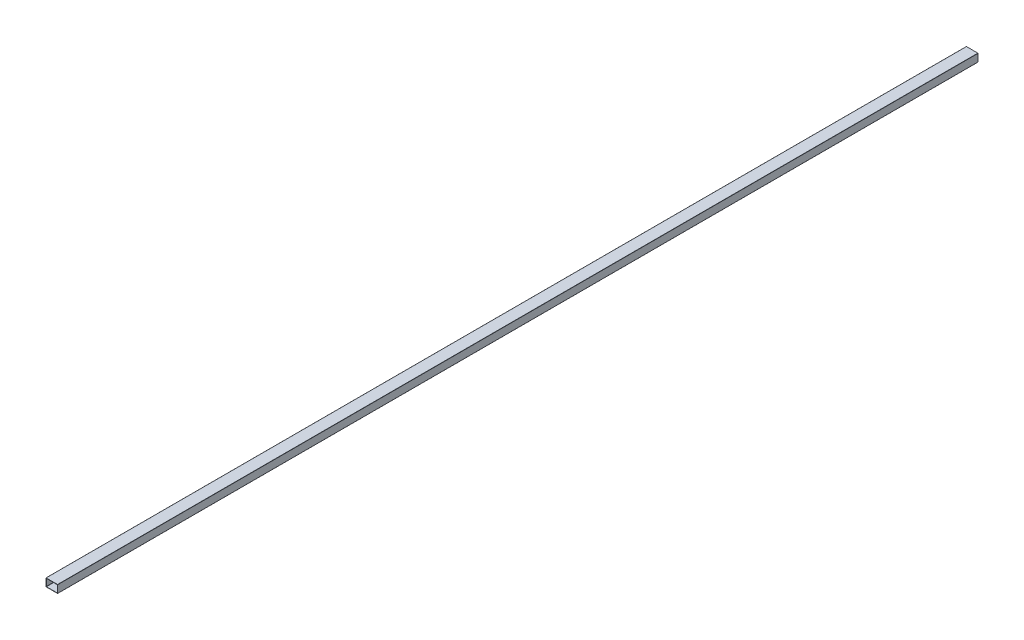
ISO-10303-21;
HEADER;
FILE_DESCRIPTION(('STEP AP214'),'2;1');
FILE_NAME('part.step','',(''),(''),'','','');
FILE_SCHEMA(('AUTOMOTIVE_DESIGN { 1 0 10303 214 1 1 1 1 }'));
ENDSEC;
DATA;
#1=APPLICATION_CONTEXT('core data for automotive mechanical design processes');
#2=APPLICATION_PROTOCOL_DEFINITION('international standard','automotive_design',2000,#1);
#3=PRODUCT_CONTEXT('',#1,'mechanical');
#4=PRODUCT('Part','Part','',(#3));
#5=PRODUCT_RELATED_PRODUCT_CATEGORY('part','',(#4));
#6=PRODUCT_DEFINITION_FORMATION('','',#4);
#7=PRODUCT_DEFINITION_CONTEXT('part definition',#1,'design');
#8=PRODUCT_DEFINITION('design','',#6,#7);
#9=PRODUCT_DEFINITION_SHAPE('','',#8);
#10=(LENGTH_UNIT() NAMED_UNIT(*) SI_UNIT(.MILLI.,.METRE.));
#11=(NAMED_UNIT(*) PLANE_ANGLE_UNIT() SI_UNIT($,.RADIAN.));
#12=(NAMED_UNIT(*) SI_UNIT($,.STERADIAN.) SOLID_ANGLE_UNIT());
#13=UNCERTAINTY_MEASURE_WITH_UNIT(LENGTH_MEASURE(1.E-05),#10,'distance_accuracy_value','');
#14=(GEOMETRIC_REPRESENTATION_CONTEXT(3) GLOBAL_UNCERTAINTY_ASSIGNED_CONTEXT((#13)) GLOBAL_UNIT_ASSIGNED_CONTEXT((#10,
#11,#12)) REPRESENTATION_CONTEXT('',''));
#15=CARTESIAN_POINT('',(0.,0.,0.));
#16=DIRECTION('',(0.,0.,1.));
#17=DIRECTION('',(1.,0.,0.));
#18=AXIS2_PLACEMENT_3D('',#15,#16,#17);
#19=CARTESIAN_POINT('',(38.1,-25.4,-6000.));
#20=DIRECTION('',(1.,0.,0.));
#21=DIRECTION('',(0.,0.,-1.));
#22=AXIS2_PLACEMENT_3D('',#19,#20,#21);
#23=PLANE('',#22);
#24=DIRECTION('',(0.,1.,0.));
#25=VECTOR('',#24,1.);
#26=CARTESIAN_POINT('',(38.1,-25.4,0.));
#27=LINE('',#26,#25);
#28=CARTESIAN_POINT('',(38.1,-24.4,0.));
#29=VERTEX_POINT('',#28);
#30=CARTESIAN_POINT('',(38.1,24.4,0.));
#31=VERTEX_POINT('',#30);
#32=EDGE_CURVE('E197',#29,#31,#27,.T.);
#33=ORIENTED_EDGE('',*,*,#32,.F.);
#34=DIRECTION('',(0.,0.,1.));
#35=VECTOR('',#34,1.);
#36=CARTESIAN_POINT('',(38.1,-24.4,-6000.));
#37=LINE('',#36,#35);
#38=CARTESIAN_POINT('',(38.1,-24.4,-6000.));
#39=VERTEX_POINT('',#38);
#40=EDGE_CURVE('E158',#29,#39,#37,.F.);
#41=ORIENTED_EDGE('',*,*,#40,.T.);
#42=DIRECTION('',(0.,1.,0.));
#43=VECTOR('',#42,1.);
#44=CARTESIAN_POINT('',(38.1,-25.4,-6000.));
#45=LINE('',#44,#43);
#46=CARTESIAN_POINT('',(38.1,24.4,-6000.));
#47=VERTEX_POINT('',#46);
#48=EDGE_CURVE('E185',#39,#47,#45,.T.);
#49=ORIENTED_EDGE('',*,*,#48,.T.);
#50=DIRECTION('',(0.,0.,1.));
#51=VECTOR('',#50,1.);
#52=CARTESIAN_POINT('',(38.1,24.4,-6000.));
#53=LINE('',#52,#51);
#54=EDGE_CURVE('E251',#47,#31,#53,.T.);
#55=ORIENTED_EDGE('',*,*,#54,.T.);
#56=EDGE_LOOP('',(#33,#41,#49,#55));
#57=FACE_BOUND('',#56,.T.);
#58=ADVANCED_FACE('F33',(#57),#23,.T.);
#59=CARTESIAN_POINT('',(-38.1,-25.4,-6000.));
#60=DIRECTION('',(0.,-1.,0.));
#61=DIRECTION('',(0.,0.,-1.));
#62=AXIS2_PLACEMENT_3D('',#59,#60,#61);
#63=PLANE('',#62);
#64=DIRECTION('',(1.,0.,0.));
#65=VECTOR('',#64,1.);
#66=CARTESIAN_POINT('',(-38.1,-25.4,0.));
#67=LINE('',#66,#65);
#68=CARTESIAN_POINT('',(-37.1,-25.4,0.));
#69=VERTEX_POINT('',#68);
#70=CARTESIAN_POINT('',(37.1,-25.4,0.));
#71=VERTEX_POINT('',#70);
#72=EDGE_CURVE('E189',#69,#71,#67,.T.);
#73=ORIENTED_EDGE('',*,*,#72,.F.);
#74=DIRECTION('',(0.,0.,1.));
#75=VECTOR('',#74,1.);
#76=CARTESIAN_POINT('',(-37.1,-25.4,-6000.));
#77=LINE('',#76,#75);
#78=CARTESIAN_POINT('',(-37.1,-25.4,-6000.));
#79=VERTEX_POINT('',#78);
#80=EDGE_CURVE('E238',#69,#79,#77,.F.);
#81=ORIENTED_EDGE('',*,*,#80,.T.);
#82=DIRECTION('',(1.,0.,0.));
#83=VECTOR('',#82,1.);
#84=CARTESIAN_POINT('',(-38.1,-25.4,-6000.));
#85=LINE('',#84,#83);
#86=CARTESIAN_POINT('',(37.1,-25.4,-6000.));
#87=VERTEX_POINT('',#86);
#88=EDGE_CURVE('E194',#79,#87,#85,.T.);
#89=ORIENTED_EDGE('',*,*,#88,.T.);
#90=DIRECTION('',(0.,0.,1.));
#91=VECTOR('',#90,1.);
#92=CARTESIAN_POINT('',(37.1,-25.4,-6000.));
#93=LINE('',#92,#91);
#94=EDGE_CURVE('E235',#87,#71,#93,.T.);
#95=ORIENTED_EDGE('',*,*,#94,.T.);
#96=EDGE_LOOP('',(#73,#81,#89,#95));
#97=FACE_BOUND('',#96,.T.);
#98=ADVANCED_FACE('F305',(#97),#63,.T.);
#99=CARTESIAN_POINT('',(-38.1,-25.4,-6000.));
#100=DIRECTION('',(-1.,0.,0.));
#101=DIRECTION('',(0.,0.,1.));
#102=AXIS2_PLACEMENT_3D('',#99,#100,#101);
#103=PLANE('',#102);
#104=DIRECTION('',(0.,-1.,0.));
#105=VECTOR('',#104,1.);
#106=CARTESIAN_POINT('',(-38.1,-25.4,-6000.));
#107=LINE('',#106,#105);
#108=CARTESIAN_POINT('',(-38.1,24.4,-6000.));
#109=VERTEX_POINT('',#108);
#110=CARTESIAN_POINT('',(-38.1,-24.4,-6000.));
#111=VERTEX_POINT('',#110);
#112=EDGE_CURVE('E191',#109,#111,#107,.T.);
#113=ORIENTED_EDGE('',*,*,#112,.T.);
#114=DIRECTION('',(0.,0.,1.));
#115=VECTOR('',#114,1.);
#116=CARTESIAN_POINT('',(-38.1,-24.4,-6000.));
#117=LINE('',#116,#115);
#118=CARTESIAN_POINT('',(-38.1,-24.4,0.));
#119=VERTEX_POINT('',#118);
#120=EDGE_CURVE('E224',#111,#119,#117,.T.);
#121=ORIENTED_EDGE('',*,*,#120,.T.);
#122=DIRECTION('',(0.,-1.,0.));
#123=VECTOR('',#122,1.);
#124=CARTESIAN_POINT('',(-38.1,-25.4,0.));
#125=LINE('',#124,#123);
#126=CARTESIAN_POINT('',(-38.1,24.4,0.));
#127=VERTEX_POINT('',#126);
#128=EDGE_CURVE('E203',#127,#119,#125,.T.);
#129=ORIENTED_EDGE('',*,*,#128,.F.);
#130=DIRECTION('',(0.,0.,1.));
#131=VECTOR('',#130,1.);
#132=CARTESIAN_POINT('',(-38.1,24.4,-6000.));
#133=LINE('',#132,#131);
#134=EDGE_CURVE('E222',#127,#109,#133,.F.);
#135=ORIENTED_EDGE('',*,*,#134,.T.);
#136=EDGE_LOOP('',(#113,#121,#129,#135));
#137=FACE_BOUND('',#136,.T.);
#138=ADVANCED_FACE('F311',(#137),#103,.T.);
#139=CARTESIAN_POINT('',(-38.1,25.4,-6000.));
#140=DIRECTION('',(0.,1.,0.));
#141=DIRECTION('',(0.,0.,1.));
#142=AXIS2_PLACEMENT_3D('',#139,#140,#141);
#143=PLANE('',#142);
#144=DIRECTION('',(-1.,0.,0.));
#145=VECTOR('',#144,1.);
#146=CARTESIAN_POINT('',(-38.1,25.4,-6000.));
#147=LINE('',#146,#145);
#148=CARTESIAN_POINT('',(37.1,25.4,-6000.));
#149=VERTEX_POINT('',#148);
#150=CARTESIAN_POINT('',(-37.1,25.4,-6000.));
#151=VERTEX_POINT('',#150);
#152=EDGE_CURVE('E188',#149,#151,#147,.T.);
#153=ORIENTED_EDGE('',*,*,#152,.T.);
#154=DIRECTION('',(0.,0.,1.));
#155=VECTOR('',#154,1.);
#156=CARTESIAN_POINT('',(-37.1,25.4,-6000.));
#157=LINE('',#156,#155);
#158=CARTESIAN_POINT('',(-37.1,25.4,0.));
#159=VERTEX_POINT('',#158);
#160=EDGE_CURVE('E248',#151,#159,#157,.T.);
#161=ORIENTED_EDGE('',*,*,#160,.T.);
#162=DIRECTION('',(-1.,0.,0.));
#163=VECTOR('',#162,1.);
#164=CARTESIAN_POINT('',(-38.1,25.4,0.));
#165=LINE('',#164,#163);
#166=CARTESIAN_POINT('',(37.1,25.4,0.));
#167=VERTEX_POINT('',#166);
#168=EDGE_CURVE('E200',#167,#159,#165,.T.);
#169=ORIENTED_EDGE('',*,*,#168,.F.);
#170=DIRECTION('',(0.,0.,1.));
#171=VECTOR('',#170,1.);
#172=CARTESIAN_POINT('',(37.1,25.4,-6000.));
#173=LINE('',#172,#171);
#174=EDGE_CURVE('E55',#167,#149,#173,.F.);
#175=ORIENTED_EDGE('',*,*,#174,.T.);
#176=EDGE_LOOP('',(#153,#161,#169,#175));
#177=FACE_BOUND('',#176,.T.);
#178=ADVANCED_FACE('F316',(#177),#143,.T.);
#179=CARTESIAN_POINT('',(0.,0.,-6000.));
#180=DIRECTION('',(0.,0.,-1.));
#181=DIRECTION('',(-1.,0.,0.));
#182=AXIS2_PLACEMENT_3D('',#179,#180,#181);
#183=PLANE('',#182);
#184=DIRECTION('',(0.,-1.,0.));
#185=VECTOR('',#184,1.);
#186=CARTESIAN_POINT('',(-36.21,-23.51,-6000.));
#187=LINE('',#186,#185);
#188=CARTESIAN_POINT('',(-36.21,22.51,-6000.));
#189=VERTEX_POINT('',#188);
#190=CARTESIAN_POINT('',(-36.21,-22.51,-6000.));
#191=VERTEX_POINT('',#190);
#192=EDGE_CURVE('E167',#189,#191,#187,.T.);
#193=ORIENTED_EDGE('',*,*,#192,.T.);
#194=CARTESIAN_POINT('',(-35.21,-22.51,-6000.));
#195=DIRECTION('',(0.,0.,-1.));
#196=DIRECTION('',(-1.,0.,0.));
#197=AXIS2_PLACEMENT_3D('',#194,#195,#196);
#198=CIRCLE('',#197,1.);
#199=CARTESIAN_POINT('',(-35.21,-23.51,-6000.));
#200=VERTEX_POINT('',#199);
#201=EDGE_CURVE('E11',#191,#200,#198,.F.);
#202=ORIENTED_EDGE('',*,*,#201,.T.);
#203=DIRECTION('',(1.,0.,0.));
#204=VECTOR('',#203,1.);
#205=CARTESIAN_POINT('',(-36.21,-23.51,-6000.));
#206=LINE('',#205,#204);
#207=CARTESIAN_POINT('',(35.21,-23.51,-6000.));
#208=VERTEX_POINT('',#207);
#209=EDGE_CURVE('E175',#200,#208,#206,.T.);
#210=ORIENTED_EDGE('',*,*,#209,.T.);
#211=CARTESIAN_POINT('',(35.21,-22.51,-6000.));
#212=DIRECTION('',(0.,0.,-1.));
#213=DIRECTION('',(-1.,0.,0.));
#214=AXIS2_PLACEMENT_3D('',#211,#212,#213);
#215=CIRCLE('',#214,1.);
#216=CARTESIAN_POINT('',(36.21,-22.51,-6000.));
#217=VERTEX_POINT('',#216);
#218=EDGE_CURVE('E262',#208,#217,#215,.F.);
#219=ORIENTED_EDGE('',*,*,#218,.T.);
#220=DIRECTION('',(0.,1.,0.));
#221=VECTOR('',#220,1.);
#222=CARTESIAN_POINT('',(36.21,-23.51,-6000.));
#223=LINE('',#222,#221);
#224=CARTESIAN_POINT('',(36.21,22.51,-6000.));
#225=VERTEX_POINT('',#224);
#226=EDGE_CURVE('E179',#217,#225,#223,.T.);
#227=ORIENTED_EDGE('',*,*,#226,.T.);
#228=CARTESIAN_POINT('',(35.21,22.51,-6000.));
#229=DIRECTION('',(0.,0.,-1.));
#230=DIRECTION('',(-1.,0.,0.));
#231=AXIS2_PLACEMENT_3D('',#228,#229,#230);
#232=CIRCLE('',#231,1.);
#233=CARTESIAN_POINT('',(35.21,23.51,-6000.));
#234=VERTEX_POINT('',#233);
#235=EDGE_CURVE('E258',#225,#234,#232,.F.);
#236=ORIENTED_EDGE('',*,*,#235,.T.);
#237=DIRECTION('',(-1.,0.,0.));
#238=VECTOR('',#237,1.);
#239=CARTESIAN_POINT('',(-36.21,23.51,-6000.));
#240=LINE('',#239,#238);
#241=CARTESIAN_POINT('',(-35.21,23.51,-6000.));
#242=VERTEX_POINT('',#241);
#243=EDGE_CURVE('E277',#234,#242,#240,.T.);
#244=ORIENTED_EDGE('',*,*,#243,.T.);
#245=CARTESIAN_POINT('',(-35.21,22.51,-6000.));
#246=DIRECTION('',(0.,0.,-1.));
#247=DIRECTION('',(-1.,0.,0.));
#248=AXIS2_PLACEMENT_3D('',#245,#246,#247);
#249=CIRCLE('',#248,1.);
#250=EDGE_CURVE('E157',#242,#189,#249,.F.);
#251=ORIENTED_EDGE('',*,*,#250,.T.);
#252=EDGE_LOOP('',(#193,#202,#210,#219,#227,#236,#244,#251));
#253=FACE_BOUND('',#252,.T.);
#254=ORIENTED_EDGE('',*,*,#88,.F.);
#255=CARTESIAN_POINT('',(-37.1,-24.4,-6000.));
#256=DIRECTION('',(0.,0.,-1.));
#257=DIRECTION('',(-1.,0.,0.));
#258=AXIS2_PLACEMENT_3D('',#255,#256,#257);
#259=CIRCLE('',#258,1.);
#260=EDGE_CURVE('E245',#79,#111,#259,.T.);
#261=ORIENTED_EDGE('',*,*,#260,.T.);
#262=ORIENTED_EDGE('',*,*,#112,.F.);
#263=CARTESIAN_POINT('',(-37.1,24.4,-6000.));
#264=DIRECTION('',(0.,0.,-1.));
#265=DIRECTION('',(-1.,0.,0.));
#266=AXIS2_PLACEMENT_3D('',#263,#264,#265);
#267=CIRCLE('',#266,1.);
#268=EDGE_CURVE('E48',#109,#151,#267,.T.);
#269=ORIENTED_EDGE('',*,*,#268,.T.);
#270=ORIENTED_EDGE('',*,*,#152,.F.);
#271=CARTESIAN_POINT('',(37.1,24.4,-6000.));
#272=DIRECTION('',(0.,0.,-1.));
#273=DIRECTION('',(-1.,0.,0.));
#274=AXIS2_PLACEMENT_3D('',#271,#272,#273);
#275=CIRCLE('',#274,1.);
#276=EDGE_CURVE('E240',#149,#47,#275,.T.);
#277=ORIENTED_EDGE('',*,*,#276,.T.);
#278=ORIENTED_EDGE('',*,*,#48,.F.);
#279=CARTESIAN_POINT('',(37.1,-24.4,-6000.));
#280=DIRECTION('',(0.,0.,-1.));
#281=DIRECTION('',(-1.,0.,0.));
#282=AXIS2_PLACEMENT_3D('',#279,#280,#281);
#283=CIRCLE('',#282,1.);
#284=EDGE_CURVE('E242',#39,#87,#283,.T.);
#285=ORIENTED_EDGE('',*,*,#284,.T.);
#286=EDGE_LOOP('',(#254,#261,#262,#269,#270,#277,#278,#285));
#287=FACE_BOUND('',#286,.T.);
#288=ADVANCED_FACE('F267',(#253,#287),#183,.T.);
#289=CARTESIAN_POINT('',(0.,0.,0.));
#290=DIRECTION('',(0.,0.,-1.));
#291=DIRECTION('',(-1.,0.,0.));
#292=AXIS2_PLACEMENT_3D('',#289,#290,#291);
#293=PLANE('',#292);
#294=DIRECTION('',(0.,1.,0.));
#295=VECTOR('',#294,1.);
#296=CARTESIAN_POINT('',(36.21,-23.51,0.));
#297=LINE('',#296,#295);
#298=CARTESIAN_POINT('',(36.21,-22.51,0.));
#299=VERTEX_POINT('',#298);
#300=CARTESIAN_POINT('',(36.21,22.51,0.));
#301=VERTEX_POINT('',#300);
#302=EDGE_CURVE('E181',#299,#301,#297,.T.);
#303=ORIENTED_EDGE('',*,*,#302,.F.);
#304=CARTESIAN_POINT('',(35.21,-22.51,0.));
#305=DIRECTION('',(0.,0.,-1.));
#306=DIRECTION('',(-1.,0.,0.));
#307=AXIS2_PLACEMENT_3D('',#304,#305,#306);
#308=CIRCLE('',#307,1.);
#309=CARTESIAN_POINT('',(35.21,-23.51,0.));
#310=VERTEX_POINT('',#309);
#311=EDGE_CURVE('E260',#299,#310,#308,.T.);
#312=ORIENTED_EDGE('',*,*,#311,.T.);
#313=DIRECTION('',(1.,0.,0.));
#314=VECTOR('',#313,1.);
#315=CARTESIAN_POINT('',(-36.21,-23.51,0.));
#316=LINE('',#315,#314);
#317=CARTESIAN_POINT('',(-35.21,-23.51,0.));
#318=VERTEX_POINT('',#317);
#319=EDGE_CURVE('E281',#318,#310,#316,.T.);
#320=ORIENTED_EDGE('',*,*,#319,.F.);
#321=CARTESIAN_POINT('',(-35.21,-22.51,0.));
#322=DIRECTION('',(0.,0.,-1.));
#323=DIRECTION('',(-1.,0.,0.));
#324=AXIS2_PLACEMENT_3D('',#321,#322,#323);
#325=CIRCLE('',#324,1.);
#326=CARTESIAN_POINT('',(-36.21,-22.51,0.));
#327=VERTEX_POINT('',#326);
#328=EDGE_CURVE('E41',#318,#327,#325,.T.);
#329=ORIENTED_EDGE('',*,*,#328,.T.);
#330=DIRECTION('',(0.,-1.,0.));
#331=VECTOR('',#330,1.);
#332=CARTESIAN_POINT('',(-36.21,-23.51,0.));
#333=LINE('',#332,#331);
#334=CARTESIAN_POINT('',(-36.21,22.51,0.));
#335=VERTEX_POINT('',#334);
#336=EDGE_CURVE('E164',#335,#327,#333,.T.);
#337=ORIENTED_EDGE('',*,*,#336,.F.);
#338=CARTESIAN_POINT('',(-35.21,22.51,0.));
#339=DIRECTION('',(0.,0.,-1.));
#340=DIRECTION('',(-1.,0.,0.));
#341=AXIS2_PLACEMENT_3D('',#338,#339,#340);
#342=CIRCLE('',#341,1.);
#343=CARTESIAN_POINT('',(-35.21,23.51,0.));
#344=VERTEX_POINT('',#343);
#345=EDGE_CURVE('E147',#335,#344,#342,.T.);
#346=ORIENTED_EDGE('',*,*,#345,.T.);
#347=DIRECTION('',(-1.,0.,0.));
#348=VECTOR('',#347,1.);
#349=CARTESIAN_POINT('',(-36.21,23.51,0.));
#350=LINE('',#349,#348);
#351=CARTESIAN_POINT('',(35.21,23.51,0.));
#352=VERTEX_POINT('',#351);
#353=EDGE_CURVE('E176',#352,#344,#350,.T.);
#354=ORIENTED_EDGE('',*,*,#353,.F.);
#355=CARTESIAN_POINT('',(35.21,22.51,0.));
#356=DIRECTION('',(0.,0.,-1.));
#357=DIRECTION('',(-1.,0.,0.));
#358=AXIS2_PLACEMENT_3D('',#355,#356,#357);
#359=CIRCLE('',#358,1.);
#360=EDGE_CURVE('E256',#352,#301,#359,.T.);
#361=ORIENTED_EDGE('',*,*,#360,.T.);
#362=EDGE_LOOP('',(#303,#312,#320,#329,#337,#346,#354,#361));
#363=FACE_BOUND('',#362,.T.);
#364=ORIENTED_EDGE('',*,*,#128,.T.);
#365=CARTESIAN_POINT('',(-37.1,-24.4,0.));
#366=DIRECTION('',(0.,0.,-1.));
#367=DIRECTION('',(-1.,0.,0.));
#368=AXIS2_PLACEMENT_3D('',#365,#366,#367);
#369=CIRCLE('',#368,1.);
#370=EDGE_CURVE('E233',#119,#69,#369,.F.);
#371=ORIENTED_EDGE('',*,*,#370,.T.);
#372=ORIENTED_EDGE('',*,*,#72,.T.);
#373=CARTESIAN_POINT('',(37.1,-24.4,0.));
#374=DIRECTION('',(0.,0.,-1.));
#375=DIRECTION('',(-1.,0.,0.));
#376=AXIS2_PLACEMENT_3D('',#373,#374,#375);
#377=CIRCLE('',#376,1.);
#378=EDGE_CURVE('E229',#71,#29,#377,.F.);
#379=ORIENTED_EDGE('',*,*,#378,.T.);
#380=ORIENTED_EDGE('',*,*,#32,.T.);
#381=CARTESIAN_POINT('',(37.1,24.4,0.));
#382=DIRECTION('',(0.,0.,-1.));
#383=DIRECTION('',(-1.,0.,0.));
#384=AXIS2_PLACEMENT_3D('',#381,#382,#383);
#385=CIRCLE('',#384,1.);
#386=EDGE_CURVE('E227',#31,#167,#385,.F.);
#387=ORIENTED_EDGE('',*,*,#386,.T.);
#388=ORIENTED_EDGE('',*,*,#168,.T.);
#389=CARTESIAN_POINT('',(-37.1,24.4,0.));
#390=DIRECTION('',(0.,0.,-1.));
#391=DIRECTION('',(-1.,0.,0.));
#392=AXIS2_PLACEMENT_3D('',#389,#390,#391);
#393=CIRCLE('',#392,1.);
#394=EDGE_CURVE('E231',#159,#127,#393,.F.);
#395=ORIENTED_EDGE('',*,*,#394,.T.);
#396=EDGE_LOOP('',(#364,#371,#372,#379,#380,#387,#388,#395));
#397=FACE_BOUND('',#396,.T.);
#398=ADVANCED_FACE('F172',(#363,#397),#293,.F.);
#399=CARTESIAN_POINT('',(-36.21,-23.51,-6000.));
#400=DIRECTION('',(0.,-1.,0.));
#401=DIRECTION('',(0.,0.,-1.));
#402=AXIS2_PLACEMENT_3D('',#399,#400,#401);
#403=PLANE('',#402);
#404=ORIENTED_EDGE('',*,*,#319,.T.);
#405=DIRECTION('',(0.,0.,1.));
#406=VECTOR('',#405,1.);
#407=CARTESIAN_POINT('',(35.21,-23.51,-6000.));
#408=LINE('',#407,#406);
#409=EDGE_CURVE('E220',#310,#208,#408,.F.);
#410=ORIENTED_EDGE('',*,*,#409,.T.);
#411=ORIENTED_EDGE('',*,*,#209,.F.);
#412=DIRECTION('',(0.,0.,1.));
#413=VECTOR('',#412,1.);
#414=CARTESIAN_POINT('',(-35.21,-23.51,0.));
#415=LINE('',#414,#413);
#416=EDGE_CURVE('E217',#200,#318,#415,.T.);
#417=ORIENTED_EDGE('',*,*,#416,.T.);
#418=EDGE_LOOP('',(#404,#410,#411,#417));
#419=FACE_BOUND('',#418,.T.);
#420=ADVANCED_FACE('F283',(#419),#403,.F.);
#421=CARTESIAN_POINT('',(-36.21,-23.51,-6000.));
#422=DIRECTION('',(-1.,0.,0.));
#423=DIRECTION('',(0.,0.,1.));
#424=AXIS2_PLACEMENT_3D('',#421,#422,#423);
#425=PLANE('',#424);
#426=ORIENTED_EDGE('',*,*,#192,.F.);
#427=DIRECTION('',(0.,0.,1.));
#428=VECTOR('',#427,1.);
#429=CARTESIAN_POINT('',(-36.21,22.51,0.));
#430=LINE('',#429,#428);
#431=EDGE_CURVE('E151',#189,#335,#430,.T.);
#432=ORIENTED_EDGE('',*,*,#431,.T.);
#433=ORIENTED_EDGE('',*,*,#336,.T.);
#434=DIRECTION('',(0.,0.,1.));
#435=VECTOR('',#434,1.);
#436=CARTESIAN_POINT('',(-36.21,-22.51,-6000.));
#437=LINE('',#436,#435);
#438=EDGE_CURVE('E169',#327,#191,#437,.F.);
#439=ORIENTED_EDGE('',*,*,#438,.T.);
#440=EDGE_LOOP('',(#426,#432,#433,#439));
#441=FACE_BOUND('',#440,.T.);
#442=ADVANCED_FACE('F163',(#441),#425,.F.);
#443=CARTESIAN_POINT('',(-36.21,23.51,-6000.));
#444=DIRECTION('',(0.,1.,0.));
#445=DIRECTION('',(0.,0.,1.));
#446=AXIS2_PLACEMENT_3D('',#443,#444,#445);
#447=PLANE('',#446);
#448=ORIENTED_EDGE('',*,*,#353,.T.);
#449=DIRECTION('',(0.,0.,1.));
#450=VECTOR('',#449,1.);
#451=CARTESIAN_POINT('',(-35.21,23.51,-6000.));
#452=LINE('',#451,#450);
#453=EDGE_CURVE('E152',#344,#242,#452,.F.);
#454=ORIENTED_EDGE('',*,*,#453,.T.);
#455=ORIENTED_EDGE('',*,*,#243,.F.);
#456=DIRECTION('',(0.,0.,1.));
#457=VECTOR('',#456,1.);
#458=CARTESIAN_POINT('',(35.21,23.51,0.));
#459=LINE('',#458,#457);
#460=EDGE_CURVE('E168',#234,#352,#459,.T.);
#461=ORIENTED_EDGE('',*,*,#460,.T.);
#462=EDGE_LOOP('',(#448,#454,#455,#461));
#463=FACE_BOUND('',#462,.T.);
#464=ADVANCED_FACE('F292',(#463),#447,.F.);
#465=CARTESIAN_POINT('',(36.21,-23.51,-6000.));
#466=DIRECTION('',(1.,0.,0.));
#467=DIRECTION('',(0.,0.,-1.));
#468=AXIS2_PLACEMENT_3D('',#465,#466,#467);
#469=PLANE('',#468);
#470=ORIENTED_EDGE('',*,*,#302,.T.);
#471=DIRECTION('',(0.,0.,1.));
#472=VECTOR('',#471,1.);
#473=CARTESIAN_POINT('',(36.21,22.51,-6000.));
#474=LINE('',#473,#472);
#475=EDGE_CURVE('E215',#301,#225,#474,.F.);
#476=ORIENTED_EDGE('',*,*,#475,.T.);
#477=ORIENTED_EDGE('',*,*,#226,.F.);
#478=DIRECTION('',(0.,0.,1.));
#479=VECTOR('',#478,1.);
#480=CARTESIAN_POINT('',(36.21,-22.51,0.));
#481=LINE('',#480,#479);
#482=EDGE_CURVE('E212',#217,#299,#481,.T.);
#483=ORIENTED_EDGE('',*,*,#482,.T.);
#484=EDGE_LOOP('',(#470,#476,#477,#483));
#485=FACE_BOUND('',#484,.T.);
#486=ADVANCED_FACE('F275',(#485),#469,.F.);
#487=CARTESIAN_POINT('',(-35.21,22.51,-6000.));
#488=DIRECTION('',(0.,0.,-1.));
#489=DIRECTION('',(-1.,0.,0.));
#490=AXIS2_PLACEMENT_3D('',#487,#488,#489);
#491=CYLINDRICAL_SURFACE('',#490,1.);
#492=ORIENTED_EDGE('',*,*,#250,.F.);
#493=ORIENTED_EDGE('',*,*,#453,.F.);
#494=ORIENTED_EDGE('',*,*,#345,.F.);
#495=ORIENTED_EDGE('',*,*,#431,.F.);
#496=EDGE_LOOP('',(#492,#493,#494,#495));
#497=FACE_BOUND('',#496,.T.);
#498=ADVANCED_FACE('F150',(#497),#491,.F.);
#499=CARTESIAN_POINT('',(35.21,22.51,-6000.));
#500=DIRECTION('',(0.,0.,-1.));
#501=DIRECTION('',(-1.,0.,0.));
#502=AXIS2_PLACEMENT_3D('',#499,#500,#501);
#503=CYLINDRICAL_SURFACE('',#502,1.);
#504=ORIENTED_EDGE('',*,*,#235,.F.);
#505=ORIENTED_EDGE('',*,*,#475,.F.);
#506=ORIENTED_EDGE('',*,*,#360,.F.);
#507=ORIENTED_EDGE('',*,*,#460,.F.);
#508=EDGE_LOOP('',(#504,#505,#506,#507));
#509=FACE_BOUND('',#508,.T.);
#510=ADVANCED_FACE('F294',(#509),#503,.F.);
#511=CARTESIAN_POINT('',(35.21,-22.51,-6000.));
#512=DIRECTION('',(0.,0.,-1.));
#513=DIRECTION('',(-1.,0.,0.));
#514=AXIS2_PLACEMENT_3D('',#511,#512,#513);
#515=CYLINDRICAL_SURFACE('',#514,1.);
#516=ORIENTED_EDGE('',*,*,#218,.F.);
#517=ORIENTED_EDGE('',*,*,#409,.F.);
#518=ORIENTED_EDGE('',*,*,#311,.F.);
#519=ORIENTED_EDGE('',*,*,#482,.F.);
#520=EDGE_LOOP('',(#516,#517,#518,#519));
#521=FACE_BOUND('',#520,.T.);
#522=ADVANCED_FACE('F279',(#521),#515,.F.);
#523=CARTESIAN_POINT('',(-37.1,-24.4,-6000.));
#524=DIRECTION('',(0.,0.,1.));
#525=DIRECTION('',(1.,0.,0.));
#526=AXIS2_PLACEMENT_3D('',#523,#524,#525);
#527=CYLINDRICAL_SURFACE('',#526,1.);
#528=ORIENTED_EDGE('',*,*,#260,.F.);
#529=ORIENTED_EDGE('',*,*,#80,.F.);
#530=ORIENTED_EDGE('',*,*,#370,.F.);
#531=ORIENTED_EDGE('',*,*,#120,.F.);
#532=EDGE_LOOP('',(#528,#529,#530,#531));
#533=FACE_BOUND('',#532,.T.);
#534=ADVANCED_FACE('F301',(#533),#527,.T.);
#535=CARTESIAN_POINT('',(-37.1,24.4,-6000.));
#536=DIRECTION('',(0.,0.,1.));
#537=DIRECTION('',(1.,0.,0.));
#538=AXIS2_PLACEMENT_3D('',#535,#536,#537);
#539=CYLINDRICAL_SURFACE('',#538,1.);
#540=ORIENTED_EDGE('',*,*,#268,.F.);
#541=ORIENTED_EDGE('',*,*,#134,.F.);
#542=ORIENTED_EDGE('',*,*,#394,.F.);
#543=ORIENTED_EDGE('',*,*,#160,.F.);
#544=EDGE_LOOP('',(#540,#541,#542,#543));
#545=FACE_BOUND('',#544,.T.);
#546=ADVANCED_FACE('F368',(#545),#539,.T.);
#547=CARTESIAN_POINT('',(-35.21,-22.51,-6000.));
#548=DIRECTION('',(0.,0.,-1.));
#549=DIRECTION('',(-1.,0.,0.));
#550=AXIS2_PLACEMENT_3D('',#547,#548,#549);
#551=CYLINDRICAL_SURFACE('',#550,1.);
#552=ORIENTED_EDGE('',*,*,#201,.F.);
#553=ORIENTED_EDGE('',*,*,#438,.F.);
#554=ORIENTED_EDGE('',*,*,#328,.F.);
#555=ORIENTED_EDGE('',*,*,#416,.F.);
#556=EDGE_LOOP('',(#552,#553,#554,#555));
#557=FACE_BOUND('',#556,.T.);
#558=ADVANCED_FACE('F378',(#557),#551,.F.);
#559=CARTESIAN_POINT('',(37.1,-24.4,-6000.));
#560=DIRECTION('',(0.,0.,1.));
#561=DIRECTION('',(1.,0.,0.));
#562=AXIS2_PLACEMENT_3D('',#559,#560,#561);
#563=CYLINDRICAL_SURFACE('',#562,1.);
#564=ORIENTED_EDGE('',*,*,#284,.F.);
#565=ORIENTED_EDGE('',*,*,#40,.F.);
#566=ORIENTED_EDGE('',*,*,#378,.F.);
#567=ORIENTED_EDGE('',*,*,#94,.F.);
#568=EDGE_LOOP('',(#564,#565,#566,#567));
#569=FACE_BOUND('',#568,.T.);
#570=ADVANCED_FACE('F388',(#569),#563,.T.);
#571=CARTESIAN_POINT('',(37.1,24.4,-6000.));
#572=DIRECTION('',(0.,0.,1.));
#573=DIRECTION('',(1.,0.,0.));
#574=AXIS2_PLACEMENT_3D('',#571,#572,#573);
#575=CYLINDRICAL_SURFACE('',#574,1.);
#576=ORIENTED_EDGE('',*,*,#276,.F.);
#577=ORIENTED_EDGE('',*,*,#174,.F.);
#578=ORIENTED_EDGE('',*,*,#386,.F.);
#579=ORIENTED_EDGE('',*,*,#54,.F.);
#580=EDGE_LOOP('',(#576,#577,#578,#579));
#581=FACE_BOUND('',#580,.T.);
#582=ADVANCED_FACE('F35',(#581),#575,.T.);
#583=CLOSED_SHELL('',(#58,#98,#138,#178,#288,#398,#420,#442,#464,#486,#498,#510,#522,#534,#546,
#558,#570,#582));
#584=MANIFOLD_SOLID_BREP('B2',#583);
#585=ADVANCED_BREP_SHAPE_REPRESENTATION('',(#18,#584),#14);
#586=SHAPE_DEFINITION_REPRESENTATION(#9,#585);
ENDSEC;
END-ISO-10303-21;
